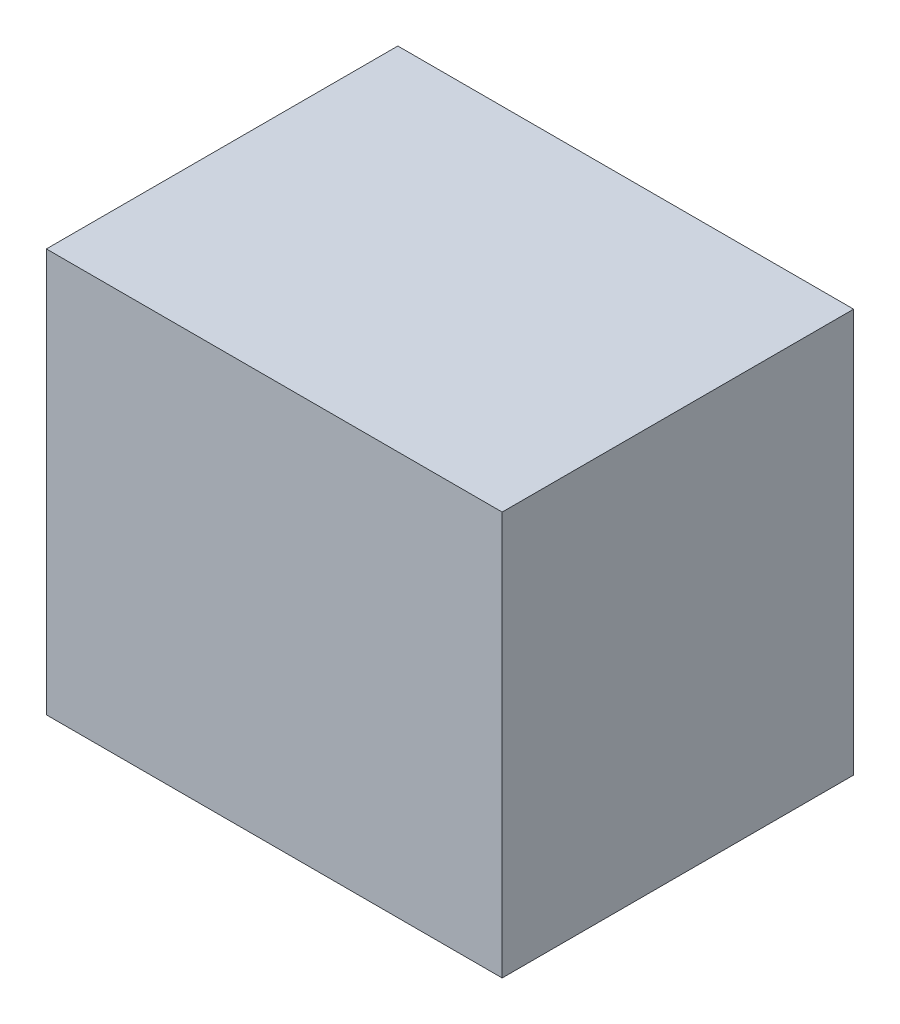
ISO-10303-21;
HEADER;
FILE_DESCRIPTION(('STEP AP214'),'2;1');
FILE_NAME('part.step','',(''),(''),'','','');
FILE_SCHEMA(('AUTOMOTIVE_DESIGN { 1 0 10303 214 1 1 1 1 }'));
ENDSEC;
DATA;
#1=APPLICATION_CONTEXT('core data for automotive mechanical design processes');
#2=APPLICATION_PROTOCOL_DEFINITION('international standard','automotive_design',2000,#1);
#3=PRODUCT_CONTEXT('',#1,'mechanical');
#4=PRODUCT('Part','Part','',(#3));
#5=PRODUCT_RELATED_PRODUCT_CATEGORY('part','',(#4));
#6=PRODUCT_DEFINITION_FORMATION('','',#4);
#7=PRODUCT_DEFINITION_CONTEXT('part definition',#1,'design');
#8=PRODUCT_DEFINITION('design','',#6,#7);
#9=PRODUCT_DEFINITION_SHAPE('','',#8);
#10=(LENGTH_UNIT() NAMED_UNIT(*) SI_UNIT(.MILLI.,.METRE.));
#11=(NAMED_UNIT(*) PLANE_ANGLE_UNIT() SI_UNIT($,.RADIAN.));
#12=(NAMED_UNIT(*) SI_UNIT($,.STERADIAN.) SOLID_ANGLE_UNIT());
#13=UNCERTAINTY_MEASURE_WITH_UNIT(LENGTH_MEASURE(1.E-05),#10,'distance_accuracy_value','');
#14=(GEOMETRIC_REPRESENTATION_CONTEXT(3) GLOBAL_UNCERTAINTY_ASSIGNED_CONTEXT((#13)) GLOBAL_UNIT_ASSIGNED_CONTEXT((#10,
#11,#12)) REPRESENTATION_CONTEXT('',''));
#15=CARTESIAN_POINT('',(0.,0.,0.));
#16=DIRECTION('',(0.,0.,1.));
#17=DIRECTION('',(1.,0.,0.));
#18=AXIS2_PLACEMENT_3D('',#15,#16,#17);
#19=CARTESIAN_POINT('',(0.,600.,-261.293760943735));
#20=DIRECTION('',(0.,0.,-1.));
#21=DIRECTION('',(-1.,0.,0.));
#22=AXIS2_PLACEMENT_3D('',#19,#20,#21);
#23=PLANE('',#22);
#24=DIRECTION('',(1.,0.,0.));
#25=VECTOR('',#24,1.);
#26=CARTESIAN_POINT('',(0.,0.,-261.293760943735));
#27=LINE('',#26,#25);
#28=CARTESIAN_POINT('',(-338.872426258635,0.,-261.293760943735));
#29=VERTEX_POINT('',#28);
#30=CARTESIAN_POINT('',(338.872426258635,0.,-261.293760943735));
#31=VERTEX_POINT('',#30);
#32=EDGE_CURVE('E137',#29,#31,#27,.T.);
#33=ORIENTED_EDGE('',*,*,#32,.F.);
#34=DIRECTION('',(0.,-1.,0.));
#35=VECTOR('',#34,1.);
#36=CARTESIAN_POINT('',(-338.872426258635,600.,-261.293760943735));
#37=LINE('',#36,#35);
#38=CARTESIAN_POINT('',(-338.872426258635,600.,-261.293760943735));
#39=VERTEX_POINT('',#38);
#40=EDGE_CURVE('E12',#39,#29,#37,.T.);
#41=ORIENTED_EDGE('',*,*,#40,.F.);
#42=DIRECTION('',(1.,0.,0.));
#43=VECTOR('',#42,1.);
#44=CARTESIAN_POINT('',(0.,600.,-261.293760943735));
#45=LINE('',#44,#43);
#46=CARTESIAN_POINT('',(338.872426258635,600.,-261.293760943735));
#47=VERTEX_POINT('',#46);
#48=EDGE_CURVE('E129',#39,#47,#45,.T.);
#49=ORIENTED_EDGE('',*,*,#48,.T.);
#50=DIRECTION('',(0.,-1.,0.));
#51=VECTOR('',#50,1.);
#52=CARTESIAN_POINT('',(338.872426258635,600.,-261.293760943735));
#53=LINE('',#52,#51);
#54=EDGE_CURVE('E68',#47,#31,#53,.T.);
#55=ORIENTED_EDGE('',*,*,#54,.T.);
#56=EDGE_LOOP('',(#33,#41,#49,#55));
#57=FACE_BOUND('',#56,.T.);
#58=ADVANCED_FACE('F65',(#57),#23,.T.);
#59=CARTESIAN_POINT('',(-338.872426258635,600.,0.));
#60=DIRECTION('',(1.,0.,0.));
#61=DIRECTION('',(0.,0.,-1.));
#62=AXIS2_PLACEMENT_3D('',#59,#60,#61);
#63=PLANE('',#62);
#64=DIRECTION('',(0.,0.,1.));
#65=VECTOR('',#64,1.);
#66=CARTESIAN_POINT('',(-338.872426258635,0.,0.));
#67=LINE('',#66,#65);
#68=CARTESIAN_POINT('',(-338.872426258635,0.,261.293760943735));
#69=VERTEX_POINT('',#68);
#70=EDGE_CURVE('E99',#29,#69,#67,.T.);
#71=ORIENTED_EDGE('',*,*,#70,.T.);
#72=DIRECTION('',(0.,-1.,0.));
#73=VECTOR('',#72,1.);
#74=CARTESIAN_POINT('',(-338.872426258635,600.,261.293760943735));
#75=LINE('',#74,#73);
#76=CARTESIAN_POINT('',(-338.872426258635,600.,261.293760943735));
#77=VERTEX_POINT('',#76);
#78=EDGE_CURVE('E75',#77,#69,#75,.T.);
#79=ORIENTED_EDGE('',*,*,#78,.F.);
#80=DIRECTION('',(0.,0.,1.));
#81=VECTOR('',#80,1.);
#82=CARTESIAN_POINT('',(-338.872426258635,600.,0.));
#83=LINE('',#82,#81);
#84=EDGE_CURVE('E116',#39,#77,#83,.T.);
#85=ORIENTED_EDGE('',*,*,#84,.F.);
#86=ORIENTED_EDGE('',*,*,#40,.T.);
#87=EDGE_LOOP('',(#71,#79,#85,#86));
#88=FACE_BOUND('',#87,.T.);
#89=ADVANCED_FACE('F152',(#88),#63,.F.);
#90=CARTESIAN_POINT('',(0.,600.,261.293760943735));
#91=DIRECTION('',(0.,0.,-1.));
#92=DIRECTION('',(-1.,0.,0.));
#93=AXIS2_PLACEMENT_3D('',#90,#91,#92);
#94=PLANE('',#93);
#95=DIRECTION('',(1.,0.,0.));
#96=VECTOR('',#95,1.);
#97=CARTESIAN_POINT('',(0.,0.,261.293760943735));
#98=LINE('',#97,#96);
#99=CARTESIAN_POINT('',(338.872426258635,0.,261.293760943735));
#100=VERTEX_POINT('',#99);
#101=EDGE_CURVE('E124',#69,#100,#98,.T.);
#102=ORIENTED_EDGE('',*,*,#101,.T.);
#103=DIRECTION('',(0.,-1.,0.));
#104=VECTOR('',#103,1.);
#105=CARTESIAN_POINT('',(338.872426258635,600.,261.293760943735));
#106=LINE('',#105,#104);
#107=CARTESIAN_POINT('',(338.872426258635,600.,261.293760943735));
#108=VERTEX_POINT('',#107);
#109=EDGE_CURVE('E121',#108,#100,#106,.T.);
#110=ORIENTED_EDGE('',*,*,#109,.F.);
#111=DIRECTION('',(1.,0.,0.));
#112=VECTOR('',#111,1.);
#113=CARTESIAN_POINT('',(0.,600.,261.293760943735));
#114=LINE('',#113,#112);
#115=EDGE_CURVE('E111',#77,#108,#114,.T.);
#116=ORIENTED_EDGE('',*,*,#115,.F.);
#117=ORIENTED_EDGE('',*,*,#78,.T.);
#118=EDGE_LOOP('',(#102,#110,#116,#117));
#119=FACE_BOUND('',#118,.T.);
#120=ADVANCED_FACE('F122',(#119),#94,.F.);
#121=CARTESIAN_POINT('',(338.872426258635,600.,0.));
#122=DIRECTION('',(1.,0.,0.));
#123=DIRECTION('',(0.,0.,-1.));
#124=AXIS2_PLACEMENT_3D('',#121,#122,#123);
#125=PLANE('',#124);
#126=DIRECTION('',(0.,0.,1.));
#127=VECTOR('',#126,1.);
#128=CARTESIAN_POINT('',(338.872426258635,0.,0.));
#129=LINE('',#128,#127);
#130=EDGE_CURVE('E141',#31,#100,#129,.T.);
#131=ORIENTED_EDGE('',*,*,#130,.F.);
#132=ORIENTED_EDGE('',*,*,#54,.F.);
#133=DIRECTION('',(0.,0.,1.));
#134=VECTOR('',#133,1.);
#135=CARTESIAN_POINT('',(338.872426258635,600.,0.));
#136=LINE('',#135,#134);
#137=EDGE_CURVE('E115',#47,#108,#136,.T.);
#138=ORIENTED_EDGE('',*,*,#137,.T.);
#139=ORIENTED_EDGE('',*,*,#109,.T.);
#140=EDGE_LOOP('',(#131,#132,#138,#139));
#141=FACE_BOUND('',#140,.T.);
#142=ADVANCED_FACE('F127',(#141),#125,.T.);
#143=CARTESIAN_POINT('',(0.,600.,0.));
#144=DIRECTION('',(0.,-1.,0.));
#145=DIRECTION('',(0.,0.,-1.));
#146=AXIS2_PLACEMENT_3D('',#143,#144,#145);
#147=PLANE('',#146);
#148=ORIENTED_EDGE('',*,*,#48,.F.);
#149=ORIENTED_EDGE('',*,*,#84,.T.);
#150=ORIENTED_EDGE('',*,*,#115,.T.);
#151=ORIENTED_EDGE('',*,*,#137,.F.);
#152=EDGE_LOOP('',(#148,#149,#150,#151));
#153=FACE_BOUND('',#152,.T.);
#154=ADVANCED_FACE('F114',(#153),#147,.F.);
#155=CARTESIAN_POINT('',(0.,0.,0.));
#156=DIRECTION('',(0.,-1.,0.));
#157=DIRECTION('',(0.,0.,-1.));
#158=AXIS2_PLACEMENT_3D('',#155,#156,#157);
#159=PLANE('',#158);
#160=ORIENTED_EDGE('',*,*,#32,.T.);
#161=ORIENTED_EDGE('',*,*,#130,.T.);
#162=ORIENTED_EDGE('',*,*,#101,.F.);
#163=ORIENTED_EDGE('',*,*,#70,.F.);
#164=EDGE_LOOP('',(#160,#161,#162,#163));
#165=FACE_BOUND('',#164,.T.);
#166=ADVANCED_FACE('F150',(#165),#159,.T.);
#167=CLOSED_SHELL('',(#58,#89,#120,#142,#154,#166));
#168=MANIFOLD_SOLID_BREP('B2',#167);
#169=CARTESIAN_POINT('',(3.79849771843405,30.0702943124558,-2.03340232874608));
#170=DIRECTION('',(-0.172009604805727,0.0237988542082163,-0.984807753012208));
#171=DIRECTION('',(-0.985086761934652,0.,0.17205833737748));
#172=AXIS2_PLACEMENT_3D('',#169,#170,#171);
#173=PLANE('',#172);
#174=DIRECTION('',(0.975514944534338,-0.134970009198789,-0.173648177666931));
#175=VECTOR('',#174,1.);
#176=CARTESIAN_POINT('',(11.381492002607,78.9318221143126,-2.17708465972366));
#177=LINE('',#176,#175);
#178=CARTESIAN_POINT('',(10.9294786085309,78.9943616502759,-2.09662325561893));
#179=VERTEX_POINT('',#178);
#180=CARTESIAN_POINT('',(25.9197965419814,76.9203356594835,-4.765));
#181=VERTEX_POINT('',#180);
#182=EDGE_CURVE('E223',#179,#181,#177,.T.);
#183=ORIENTED_EDGE('',*,*,#182,.T.);
#184=DIRECTION('',(-0.137052139146914,-0.990563834972414,0.));
#185=VECTOR('',#184,1.);
#186=CARTESIAN_POINT('',(19.1439760676194,27.9471291415336,-4.765));
#187=LINE('',#186,#185);
#188=CARTESIAN_POINT('',(22.4386722076498,51.7600142511842,-4.765));
#189=VERTEX_POINT('',#188);
#190=EDGE_CURVE('E336',#181,#189,#187,.T.);
#191=ORIENTED_EDGE('',*,*,#190,.T.);
#192=DIRECTION('',(-0.975514944534338,0.134970009198788,0.173648177666931));
#193=VECTOR('',#192,1.);
#194=CARTESIAN_POINT('',(7.09319385846442,53.8831794221064,-2.03340232874608));
#195=LINE('',#194,#193);
#196=CARTESIAN_POINT('',(7.44835427419923,53.8340402419766,-2.09662325561893));
#197=VERTEX_POINT('',#196);
#198=EDGE_CURVE('E364',#189,#197,#195,.T.);
#199=ORIENTED_EDGE('',*,*,#198,.T.);
#200=CARTESIAN_POINT('',(5.5602363326343,54.0952759076824,-1.76052564726348));
#201=VERTEX_POINT('',#200);
#202=EDGE_CURVE('E355',#197,#201,#195,.T.);
#203=ORIENTED_EDGE('',*,*,#202,.T.);
#204=DIRECTION('',(0.137052139146914,0.990563834972414,0.));
#205=VECTOR('',#204,1.);
#206=CARTESIAN_POINT('',(2.2655401926039,30.2823907980318,-1.76052564726348));
#207=LINE('',#206,#205);
#208=CARTESIAN_POINT('',(9.04136066696591,79.2555973159817,-1.76052564726348));
#209=VERTEX_POINT('',#208);
#210=EDGE_CURVE('E371',#201,#209,#207,.T.);
#211=ORIENTED_EDGE('',*,*,#210,.T.);
#212=DIRECTION('',(-0.975514944534338,0.134970009198789,0.173648177666931));
#213=VECTOR('',#212,1.);
#214=CARTESIAN_POINT('',(10.5743181927961,79.0435008304057,-2.03340232874608));
#215=LINE('',#214,#213);
#216=EDGE_CURVE('E351',#179,#209,#215,.T.);
#217=ORIENTED_EDGE('',*,*,#216,.F.);
#218=EDGE_LOOP('',(#183,#191,#199,#203,#211,#217));
#219=FACE_BOUND('',#218,.T.);
#220=ADVANCED_FACE('F213',(#219),#173,.T.);
#221=CARTESIAN_POINT('',(5.43774925223263,29.8434912318515,7.35181555746026));
#222=DIRECTION('',(-0.172009604805727,0.0237988542082164,-0.984807753012208));
#223=DIRECTION('',(-0.985086761934652,0.,0.17205833737748));
#224=AXIS2_PLACEMENT_3D('',#221,#222,#223);
#225=PLANE('',#224);
#226=DIRECTION('',(0.137052139146914,0.990563834972414,0.));
#227=VECTOR('',#226,1.);
#228=CARTESIAN_POINT('',(23.2645716083907,51.6457447053,4.765));
#229=LINE('',#228,#227);
#230=CARTESIAN_POINT('',(23.2645716083907,51.6457447052999,4.765));
#231=VERTEX_POINT('',#230);
#232=CARTESIAN_POINT('',(26.7456959427223,76.8060661135992,4.765));
#233=VERTEX_POINT('',#232);
#234=EDGE_CURVE('E237',#231,#233,#229,.T.);
#235=ORIENTED_EDGE('',*,*,#234,.T.);
#236=DIRECTION('',(-0.975514944534338,0.134970009198789,0.173648177666932));
#237=VECTOR('',#236,1.);
#238=CARTESIAN_POINT('',(12.2135697265946,78.8166977498014,7.35181555746026));
#239=LINE('',#238,#237);
#240=CARTESIAN_POINT('',(10.6806122007645,79.0287942353774,7.62469223894286));
#241=VERTEX_POINT('',#240);
#242=EDGE_CURVE('E352',#233,#241,#239,.T.);
#243=ORIENTED_EDGE('',*,*,#242,.T.);
#244=DIRECTION('',(0.137052139146914,0.990563834972414,0.));
#245=VECTOR('',#244,1.);
#246=CARTESIAN_POINT('',(3.90479172640249,30.0555877174275,7.62469223894286));
#247=LINE('',#246,#245);
#248=CARTESIAN_POINT('',(7.19948786643288,53.8684728270781,7.62469223894286));
#249=VERTEX_POINT('',#248);
#250=EDGE_CURVE('E356',#249,#241,#247,.T.);
#251=ORIENTED_EDGE('',*,*,#250,.F.);
#252=DIRECTION('',(-0.975514944534338,0.134970009198788,0.173648177666931));
#253=VECTOR('',#252,1.);
#254=CARTESIAN_POINT('',(8.732445392263,53.6563763415021,7.35181555746026));
#255=LINE('',#254,#253);
#256=EDGE_CURVE('E359',#231,#249,#255,.T.);
#257=ORIENTED_EDGE('',*,*,#256,.F.);
#258=EDGE_LOOP('',(#235,#243,#251,#257));
#259=FACE_BOUND('',#258,.T.);
#260=ADVANCED_FACE('F512',(#259),#225,.F.);
#261=CARTESIAN_POINT('',(0.,0.,-4.765));
#262=DIRECTION('',(0.,0.,-1.));
#263=DIRECTION('',(-1.,0.,0.));
#264=AXIS2_PLACEMENT_3D('',#261,#262,#263);
#265=PLANE('',#264);
#266=DIRECTION('',(0.581238193719096,-0.813733471206735,0.));
#267=VECTOR('',#266,1.);
#268=CARTESIAN_POINT('',(33.4606591615412,139.831077173842,-4.765));
#269=LINE('',#268,#267);
#270=CARTESIAN_POINT('',(69.84,88.9,-4.765));
#271=VERTEX_POINT('',#270);
#272=CARTESIAN_POINT('',(133.34,0.,-4.765));
#273=VERTEX_POINT('',#272);
#274=EDGE_CURVE('E410',#271,#273,#269,.T.);
#275=ORIENTED_EDGE('',*,*,#274,.T.);
#276=DIRECTION('',(1.,0.,0.));
#277=VECTOR('',#276,1.);
#278=CARTESIAN_POINT('',(0.,0.,-4.765));
#279=LINE('',#278,#277);
#280=CARTESIAN_POINT('',(0.,0.,-4.765));
#281=VERTEX_POINT('',#280);
#282=EDGE_CURVE('E440',#281,#273,#279,.T.);
#283=ORIENTED_EDGE('',*,*,#282,.F.);
#284=DIRECTION('',(-0.137052139146914,-0.990563834972414,0.));
#285=VECTOR('',#284,1.);
#286=CARTESIAN_POINT('',(0.,0.,-4.765));
#287=LINE('',#286,#285);
#288=CARTESIAN_POINT('',(7.44835427419923,53.8340402419766,-4.765));
#289=VERTEX_POINT('',#288);
#290=EDGE_CURVE('E435',#289,#281,#287,.T.);
#291=ORIENTED_EDGE('',*,*,#290,.F.);
#292=DIRECTION('',(0.990563834972414,-0.137052139146913,0.));
#293=VECTOR('',#292,1.);
#294=CARTESIAN_POINT('',(7.44835427419919,53.8340402419766,-4.765));
#295=LINE('',#294,#293);
#296=EDGE_CURVE('E379',#289,#189,#295,.T.);
#297=ORIENTED_EDGE('',*,*,#296,.T.);
#298=ORIENTED_EDGE('',*,*,#190,.F.);
#299=DIRECTION('',(0.990563834972414,-0.137052139146914,0.));
#300=VECTOR('',#299,1.);
#301=CARTESIAN_POINT('',(10.9294786085308,78.9943616502759,-4.765));
#302=LINE('',#301,#300);
#303=CARTESIAN_POINT('',(10.9294786085309,78.9943616502759,-4.765));
#304=VERTEX_POINT('',#303);
#305=EDGE_CURVE('E376',#304,#181,#302,.T.);
#306=ORIENTED_EDGE('',*,*,#305,.F.);
#307=CARTESIAN_POINT('',(12.3,88.9,-4.765));
#308=VERTEX_POINT('',#307);
#309=EDGE_CURVE('E436',#308,#304,#287,.T.);
#310=ORIENTED_EDGE('',*,*,#309,.F.);
#311=DIRECTION('',(-1.,0.,0.));
#312=VECTOR('',#311,1.);
#313=CARTESIAN_POINT('',(12.3,88.9,-4.765));
#314=LINE('',#313,#312);
#315=EDGE_CURVE('E443',#271,#308,#314,.T.);
#316=ORIENTED_EDGE('',*,*,#315,.F.);
#317=EDGE_LOOP('',(#275,#283,#291,#297,#298,#306,#310,#316));
#318=FACE_BOUND('',#317,.T.);
#319=ADVANCED_FACE('F484',(#318),#265,.T.);
#320=CARTESIAN_POINT('',(0.,0.,-4.765));
#321=DIRECTION('',(-0.990563834972414,0.137052139146914,0.));
#322=DIRECTION('',(-0.137052139146914,-0.990563834972414,0.));
#323=AXIS2_PLACEMENT_3D('',#320,#321,#322);
#324=PLANE('',#323);
#325=ORIENTED_EDGE('',*,*,#309,.T.);
#326=DIRECTION('',(0.,0.,1.));
#327=VECTOR('',#326,1.);
#328=CARTESIAN_POINT('',(10.9294786085309,78.9943616502759,-4.765));
#329=LINE('',#328,#327);
#330=EDGE_CURVE('E395',#304,#179,#329,.T.);
#331=ORIENTED_EDGE('',*,*,#330,.T.);
#332=CARTESIAN_POINT('',(10.9294786085309,78.9943616502759,4.765));
#333=VERTEX_POINT('',#332);
#334=EDGE_CURVE('E383',#179,#333,#329,.T.);
#335=ORIENTED_EDGE('',*,*,#334,.T.);
#336=DIRECTION('',(-0.137052139146914,-0.990563834972414,0.));
#337=VECTOR('',#336,1.);
#338=CARTESIAN_POINT('',(0.,0.,4.765));
#339=LINE('',#338,#337);
#340=CARTESIAN_POINT('',(12.3,88.9,4.765));
#341=VERTEX_POINT('',#340);
#342=EDGE_CURVE('E424',#341,#333,#339,.T.);
#343=ORIENTED_EDGE('',*,*,#342,.F.);
#344=DIRECTION('',(0.,0.,1.));
#345=VECTOR('',#344,1.);
#346=CARTESIAN_POINT('',(12.3,88.9,-4.765));
#347=LINE('',#346,#345);
#348=EDGE_CURVE('E447',#308,#341,#347,.T.);
#349=ORIENTED_EDGE('',*,*,#348,.F.);
#350=EDGE_LOOP('',(#325,#331,#335,#343,#349));
#351=FACE_BOUND('',#350,.T.);
#352=ADVANCED_FACE('F510',(#351),#324,.T.);
#353=DIRECTION('',(0.,0.,1.));
#354=VECTOR('',#353,1.);
#355=CARTESIAN_POINT('',(7.44835427419923,53.8340402419766,-4.765));
#356=LINE('',#355,#354);
#357=EDGE_CURVE('E389',#289,#197,#356,.T.);
#358=ORIENTED_EDGE('',*,*,#357,.F.);
#359=ORIENTED_EDGE('',*,*,#290,.T.);
#360=DIRECTION('',(0.,0.,1.));
#361=VECTOR('',#360,1.);
#362=CARTESIAN_POINT('',(0.,0.,-4.765));
#363=LINE('',#362,#361);
#364=CARTESIAN_POINT('',(0.,0.,4.765));
#365=VERTEX_POINT('',#364);
#366=EDGE_CURVE('E446',#281,#365,#363,.T.);
#367=ORIENTED_EDGE('',*,*,#366,.T.);
#368=CARTESIAN_POINT('',(7.44835427419923,53.8340402419766,4.765));
#369=VERTEX_POINT('',#368);
#370=EDGE_CURVE('E423',#369,#365,#339,.T.);
#371=ORIENTED_EDGE('',*,*,#370,.F.);
#372=EDGE_CURVE('E394',#197,#369,#356,.T.);
#373=ORIENTED_EDGE('',*,*,#372,.F.);
#374=EDGE_LOOP('',(#358,#359,#367,#371,#373));
#375=FACE_BOUND('',#374,.T.);
#376=ADVANCED_FACE('F215',(#375),#324,.T.);
#377=CARTESIAN_POINT('',(12.3,88.9,-4.765));
#378=DIRECTION('',(0.,1.,0.));
#379=DIRECTION('',(0.,0.,1.));
#380=AXIS2_PLACEMENT_3D('',#377,#378,#379);
#381=PLANE('',#380);
#382=DIRECTION('',(0.964059128190834,0.,-0.265687781713668));
#383=VECTOR('',#382,1.);
#384=CARTESIAN_POINT('',(53.318676734993,88.9,9.31815820461297));
#385=LINE('',#384,#383);
#386=CARTESIAN_POINT('',(69.84,88.9,4.765));
#387=VERTEX_POINT('',#386);
#388=CARTESIAN_POINT('',(87.13,88.9,0.));
#389=VERTEX_POINT('',#388);
#390=EDGE_CURVE('E412',#387,#389,#385,.T.);
#391=ORIENTED_EDGE('',*,*,#390,.T.);
#392=DIRECTION('',(-0.964059128190834,0.,-0.265687781713668));
#393=VECTOR('',#392,1.);
#394=CARTESIAN_POINT('',(53.318676734993,88.9,-9.31815820461297));
#395=LINE('',#394,#393);
#396=EDGE_CURVE('E406',#389,#271,#395,.T.);
#397=ORIENTED_EDGE('',*,*,#396,.T.);
#398=ORIENTED_EDGE('',*,*,#315,.T.);
#399=ORIENTED_EDGE('',*,*,#348,.T.);
#400=DIRECTION('',(-1.,0.,0.));
#401=VECTOR('',#400,1.);
#402=CARTESIAN_POINT('',(12.3,88.9,4.765));
#403=LINE('',#402,#401);
#404=EDGE_CURVE('E432',#387,#341,#403,.T.);
#405=ORIENTED_EDGE('',*,*,#404,.F.);
#406=EDGE_LOOP('',(#391,#397,#398,#399,#405));
#407=FACE_BOUND('',#406,.T.);
#408=ADVANCED_FACE('F491',(#407),#381,.T.);
#409=CARTESIAN_POINT('',(0.,0.,-4.765));
#410=DIRECTION('',(0.,-1.,0.));
#411=DIRECTION('',(0.,0.,-1.));
#412=AXIS2_PLACEMENT_3D('',#409,#410,#411);
#413=PLANE('',#412);
#414=DIRECTION('',(0.964059128190834,0.,-0.265687781713668));
#415=VECTOR('',#414,1.);
#416=CARTESIAN_POINT('',(150.63,0.,0.));
#417=LINE('',#416,#415);
#418=CARTESIAN_POINT('',(133.34,0.,4.765));
#419=VERTEX_POINT('',#418);
#420=CARTESIAN_POINT('',(150.63,0.,0.));
#421=VERTEX_POINT('',#420);
#422=EDGE_CURVE('E398',#419,#421,#417,.T.);
#423=ORIENTED_EDGE('',*,*,#422,.F.);
#424=DIRECTION('',(1.,0.,0.));
#425=VECTOR('',#424,1.);
#426=CARTESIAN_POINT('',(0.,0.,4.765));
#427=LINE('',#426,#425);
#428=EDGE_CURVE('E428',#365,#419,#427,.T.);
#429=ORIENTED_EDGE('',*,*,#428,.F.);
#430=ORIENTED_EDGE('',*,*,#366,.F.);
#431=ORIENTED_EDGE('',*,*,#282,.T.);
#432=DIRECTION('',(-0.964059128190834,0.,-0.265687781713668));
#433=VECTOR('',#432,1.);
#434=CARTESIAN_POINT('',(150.63,0.,0.));
#435=LINE('',#434,#433);
#436=EDGE_CURVE('E393',#421,#273,#435,.T.);
#437=ORIENTED_EDGE('',*,*,#436,.F.);
#438=EDGE_LOOP('',(#423,#429,#430,#431,#437));
#439=FACE_BOUND('',#438,.T.);
#440=ADVANCED_FACE('F482',(#439),#413,.T.);
#441=CARTESIAN_POINT('',(0.,0.,4.765));
#442=DIRECTION('',(0.,0.,-1.));
#443=DIRECTION('',(-1.,0.,0.));
#444=AXIS2_PLACEMENT_3D('',#441,#442,#443);
#445=PLANE('',#444);
#446=ORIENTED_EDGE('',*,*,#234,.F.);
#447=DIRECTION('',(0.990563834972414,-0.137052139146913,0.));
#448=VECTOR('',#447,1.);
#449=CARTESIAN_POINT('',(7.44835427419919,53.8340402419766,4.765));
#450=LINE('',#449,#448);
#451=EDGE_CURVE('E380',#369,#231,#450,.T.);
#452=ORIENTED_EDGE('',*,*,#451,.F.);
#453=ORIENTED_EDGE('',*,*,#370,.T.);
#454=ORIENTED_EDGE('',*,*,#428,.T.);
#455=DIRECTION('',(0.581238193719096,-0.813733471206735,0.));
#456=VECTOR('',#455,1.);
#457=CARTESIAN_POINT('',(33.4606591615412,139.831077173842,4.765));
#458=LINE('',#457,#456);
#459=EDGE_CURVE('E402',#387,#419,#458,.T.);
#460=ORIENTED_EDGE('',*,*,#459,.F.);
#461=ORIENTED_EDGE('',*,*,#404,.T.);
#462=ORIENTED_EDGE('',*,*,#342,.T.);
#463=DIRECTION('',(0.990563834972414,-0.137052139146914,0.));
#464=VECTOR('',#463,1.);
#465=CARTESIAN_POINT('',(10.9294786085308,78.9943616502759,4.765));
#466=LINE('',#465,#464);
#467=EDGE_CURVE('E375',#333,#233,#466,.T.);
#468=ORIENTED_EDGE('',*,*,#467,.T.);
#469=EDGE_LOOP('',(#446,#452,#453,#454,#460,#461,#462,#468));
#470=FACE_BOUND('',#469,.T.);
#471=ADVANCED_FACE('F498',(#470),#445,.F.);
#472=CARTESIAN_POINT('',(50.7506591615412,139.831077173842,0.));
#473=DIRECTION('',(-0.261028842296734,-0.186449173069096,-0.947153973412495));
#474=DIRECTION('',(-0.964059128190834,0.,0.265687781713668));
#475=AXIS2_PLACEMENT_3D('',#472,#473,#474);
#476=PLANE('',#475);
#477=ORIENTED_EDGE('',*,*,#459,.T.);
#478=ORIENTED_EDGE('',*,*,#422,.T.);
#479=DIRECTION('',(0.581238193719096,-0.813733471206735,0.));
#480=VECTOR('',#479,1.);
#481=CARTESIAN_POINT('',(50.7506591615412,139.831077173842,0.));
#482=LINE('',#481,#480);
#483=EDGE_CURVE('E411',#389,#421,#482,.T.);
#484=ORIENTED_EDGE('',*,*,#483,.F.);
#485=ORIENTED_EDGE('',*,*,#390,.F.);
#486=EDGE_LOOP('',(#477,#478,#484,#485));
#487=FACE_BOUND('',#486,.T.);
#488=ADVANCED_FACE('F496',(#487),#476,.F.);
#489=CARTESIAN_POINT('',(50.7506591615412,139.831077173842,0.));
#490=DIRECTION('',(-0.261028842296734,-0.186449173069096,0.947153973412495));
#491=DIRECTION('',(0.964059128190834,0.,0.265687781713668));
#492=AXIS2_PLACEMENT_3D('',#489,#490,#491);
#493=PLANE('',#492);
#494=ORIENTED_EDGE('',*,*,#483,.T.);
#495=ORIENTED_EDGE('',*,*,#436,.T.);
#496=ORIENTED_EDGE('',*,*,#274,.F.);
#497=ORIENTED_EDGE('',*,*,#396,.F.);
#498=EDGE_LOOP('',(#494,#495,#496,#497));
#499=FACE_BOUND('',#498,.T.);
#500=ADVANCED_FACE('F488',(#499),#493,.F.);
#501=CARTESIAN_POINT('',(7.44835427419919,53.8340402419766,-4.765));
#502=DIRECTION('',(-0.137052139146913,-0.990563834972414,0.));
#503=DIRECTION('',(0.990563834972414,-0.137052139146913,0.));
#504=AXIS2_PLACEMENT_3D('',#501,#502,#503);
#505=PLANE('',#504);
#506=ORIENTED_EDGE('',*,*,#357,.T.);
#507=ORIENTED_EDGE('',*,*,#198,.F.);
#508=ORIENTED_EDGE('',*,*,#296,.F.);
#509=EDGE_LOOP('',(#506,#507,#508));
#510=FACE_BOUND('',#509,.T.);
#511=ADVANCED_FACE('F508',(#510),#505,.F.);
#512=CARTESIAN_POINT('',(10.9294786085308,78.9943616502759,-4.765));
#513=DIRECTION('',(-0.137052139146914,-0.990563834972414,0.));
#514=DIRECTION('',(0.990563834972414,-0.137052139146914,0.));
#515=AXIS2_PLACEMENT_3D('',#512,#513,#514);
#516=PLANE('',#515);
#517=ORIENTED_EDGE('',*,*,#182,.F.);
#518=ORIENTED_EDGE('',*,*,#330,.F.);
#519=ORIENTED_EDGE('',*,*,#305,.T.);
#520=EDGE_LOOP('',(#517,#518,#519));
#521=FACE_BOUND('',#520,.T.);
#522=ADVANCED_FACE('F552',(#521),#516,.T.);
#523=CARTESIAN_POINT('',(7.44835427419919,53.8340402419766,-4.765));
#524=DIRECTION('',(-0.137052139146913,-0.990563834972414,0.));
#525=DIRECTION('',(0.990563834972414,-0.137052139146913,0.));
#526=AXIS2_PLACEMENT_3D('',#523,#524,#525);
#527=PLANE('',#526);
#528=ORIENTED_EDGE('',*,*,#202,.F.);
#529=ORIENTED_EDGE('',*,*,#372,.T.);
#530=ORIENTED_EDGE('',*,*,#451,.T.);
#531=ORIENTED_EDGE('',*,*,#256,.T.);
#532=DIRECTION('',(0.172009604805727,-0.0237988542082163,0.984807753012208));
#533=VECTOR('',#532,1.);
#534=CARTESIAN_POINT('',(5.91539674836908,54.0461367275526,0.272876681482568));
#535=LINE('',#534,#533);
#536=EDGE_CURVE('E350',#201,#249,#535,.T.);
#537=ORIENTED_EDGE('',*,*,#536,.F.);
#538=EDGE_LOOP('',(#528,#529,#530,#531,#537));
#539=FACE_BOUND('',#538,.T.);
#540=ADVANCED_FACE('F505',(#539),#527,.T.);
#541=CARTESIAN_POINT('',(10.9294786085308,78.9943616502759,0.));
#542=DIRECTION('',(-0.137052139146914,-0.990563834972414,0.));
#543=DIRECTION('',(0.990563834972414,-0.137052139146914,0.));
#544=AXIS2_PLACEMENT_3D('',#541,#542,#543);
#545=PLANE('',#544);
#546=ORIENTED_EDGE('',*,*,#334,.F.);
#547=ORIENTED_EDGE('',*,*,#216,.T.);
#548=DIRECTION('',(0.172009604805727,-0.023798854208216,0.984807753012208));
#549=VECTOR('',#548,1.);
#550=CARTESIAN_POINT('',(9.3965210827007,79.2064581358519,0.27287668148257));
#551=LINE('',#550,#549);
#552=EDGE_CURVE('E346',#209,#241,#551,.T.);
#553=ORIENTED_EDGE('',*,*,#552,.T.);
#554=ORIENTED_EDGE('',*,*,#242,.F.);
#555=ORIENTED_EDGE('',*,*,#467,.F.);
#556=EDGE_LOOP('',(#546,#547,#553,#554,#555));
#557=FACE_BOUND('',#556,.T.);
#558=ADVANCED_FACE('F463',(#557),#545,.F.);
#559=CARTESIAN_POINT('',(2.62070060833869,30.233251617902,0.27287668148257));
#560=DIRECTION('',(-0.975514944534338,0.134970009198789,0.173648177666932));
#561=DIRECTION('',(0.175251786866792,0.,0.984523646846533));
#562=AXIS2_PLACEMENT_3D('',#559,#560,#561);
#563=PLANE('',#562);
#564=ORIENTED_EDGE('',*,*,#210,.F.);
#565=ORIENTED_EDGE('',*,*,#536,.T.);
#566=ORIENTED_EDGE('',*,*,#250,.T.);
#567=ORIENTED_EDGE('',*,*,#552,.F.);
#568=EDGE_LOOP('',(#564,#565,#566,#567));
#569=FACE_BOUND('',#568,.T.);
#570=ADVANCED_FACE('F514',(#569),#563,.T.);
#571=CLOSED_SHELL('',(#220,#260,#319,#352,#376,#408,#440,#471,#488,#500,#511,#522,#540,#558,#570));
#572=CARTESIAN_POINT('',(5.43774925223263,29.8434912318515,7.35181555746026));
#573=DIRECTION('',(-0.172009604805727,0.0237988542082164,-0.984807753012208));
#574=DIRECTION('',(-0.985086761934652,0.,0.17205833737748));
#575=AXIS2_PLACEMENT_3D('',#572,#573,#574);
#576=PLANE('',#575);
#577=DIRECTION('',(-0.985095272476007,-0.00415556913281087,0.1719594004136));
#578=VECTOR('',#577,1.);
#579=CARTESIAN_POINT('',(53.9820423199122,51.4162500289789,-0.605755552934865));
#580=LINE('',#579,#578);
#581=CARTESIAN_POINT('',(26.3291659878577,51.2995979217873,4.22136337315594));
#582=VERTEX_POINT('',#581);
#583=CARTESIAN_POINT('',(25.783047559812,51.2972941518412,4.31669445438781));
#584=VERTEX_POINT('',#583);
#585=EDGE_CURVE('E63',#582,#584,#580,.T.);
#586=ORIENTED_EDGE('',*,*,#585,.F.);
#587=DIRECTION('',(-0.137052139146915,-0.990563834972414,0.));
#588=VECTOR('',#587,1.);
#589=CARTESIAN_POINT('',(18.8702410562244,-2.61084325074872,4.22136337315595));
#590=LINE('',#589,#588);
#591=CARTESIAN_POINT('',(26.3185953304237,51.2231969912279,4.22136337315595));
#592=VERTEX_POINT('',#591);
#593=EDGE_CURVE('E314',#582,#592,#590,.T.);
#594=ORIENTED_EDGE('',*,*,#593,.T.);
#595=DIRECTION('',(-0.975514944534338,0.13497000919879,0.173648177666931));
#596=VECTOR('',#595,1.);
#597=CARTESIAN_POINT('',(-83.2344500725946,66.3807049603744,23.7225373927684));
#598=LINE('',#597,#596);
#599=EDGE_CURVE('E333',#592,#584,#598,.T.);
#600=ORIENTED_EDGE('',*,*,#599,.T.);
#601=EDGE_LOOP('',(#586,#594,#600));
#602=FACE_BOUND('',#601,.T.);
#603=ADVANCED_FACE('F332',(#602),#576,.T.);
#604=DIRECTION('',(0.990563834972413,-0.137052139146915,0.));
#605=VECTOR('',#604,1.);
#606=CARTESIAN_POINT('',(-10.9129587694543,56.3744693807498,4.22136337315595));
#607=LINE('',#606,#605);
#608=CARTESIAN_POINT('',(25.766396734755,51.2995979217872,4.22136337315595));
#609=VERTEX_POINT('',#608);
#610=EDGE_CURVE('E319',#609,#592,#607,.T.);
#611=ORIENTED_EDGE('',*,*,#610,.F.);
#612=DIRECTION('',(0.172009604805727,-0.0237988542082163,0.984807753012208));
#613=VECTOR('',#612,1.);
#614=CARTESIAN_POINT('',(24.4989564417482,51.4749580523157,-3.03512110307248));
#615=LINE('',#614,#613);
#616=EDGE_CURVE('E325',#609,#584,#615,.T.);
#617=ORIENTED_EDGE('',*,*,#616,.T.);
#618=ORIENTED_EDGE('',*,*,#599,.F.);
#619=EDGE_LOOP('',(#611,#617,#618));
#620=FACE_BOUND('',#619,.T.);
#621=ADVANCED_FACE('F530',(#620),#505,.F.);
#622=CARTESIAN_POINT('',(53.255575665439,51.5167622882591,-4.765));
#623=DIRECTION('',(0.,0.999708130297819,0.0241589365751076));
#624=DIRECTION('',(0.,-0.0241589365751076,0.999708130297819));
#625=AXIS2_PLACEMENT_3D('',#622,#623,#624);
#626=PLANE('',#625);
#627=DIRECTION('',(1.,0.,0.));
#628=VECTOR('',#627,1.);
#629=CARTESIAN_POINT('',(-10.9129587694543,51.2995979217872,4.221363373156));
#630=LINE('',#629,#628);
#631=EDGE_CURVE('E317',#609,#582,#630,.T.);
#632=ORIENTED_EDGE('',*,*,#631,.T.);
#633=ORIENTED_EDGE('',*,*,#585,.T.);
#634=ORIENTED_EDGE('',*,*,#616,.F.);
#635=EDGE_LOOP('',(#632,#633,#634));
#636=FACE_BOUND('',#635,.T.);
#637=ADVANCED_FACE('F329',(#636),#626,.F.);
#638=CARTESIAN_POINT('',(-10.9129587694543,56.3744693807498,4.22136337315595));
#639=DIRECTION('',(0.,0.,-1.));
#640=DIRECTION('',(0.,1.,0.));
#641=AXIS2_PLACEMENT_3D('',#638,#639,#640);
#642=PLANE('',#641);
#643=ORIENTED_EDGE('',*,*,#631,.F.);
#644=ORIENTED_EDGE('',*,*,#610,.T.);
#645=ORIENTED_EDGE('',*,*,#593,.F.);
#646=EDGE_LOOP('',(#643,#644,#645));
#647=FACE_BOUND('',#646,.T.);
#648=ADVANCED_FACE('F316',(#647),#642,.F.);
#649=CLOSED_SHELL('',(#603,#621,#637,#648));
#650=ORIENTED_CLOSED_SHELL('',*,#649,.T.);
#651=BREP_WITH_VOIDS('B6',#571,(#650));
#652=ADVANCED_BREP_SHAPE_REPRESENTATION('',(#18,#168,#651),#14);
#653=SHAPE_DEFINITION_REPRESENTATION(#9,#652);
ENDSEC;
END-ISO-10303-21;
